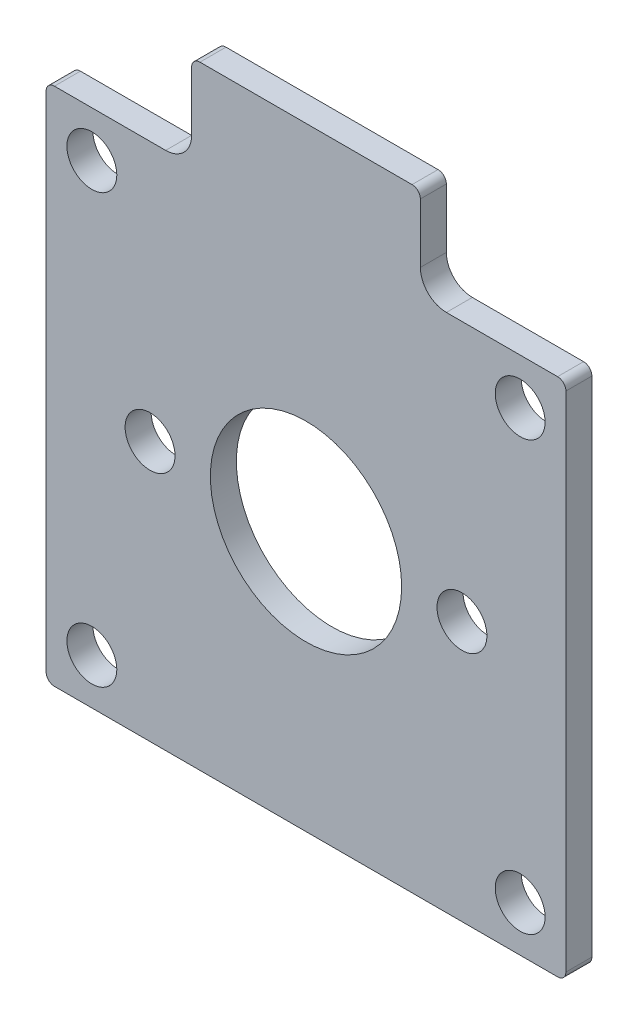
ISO-10303-21;
HEADER;
FILE_DESCRIPTION(('STEP AP214'),'2;1');
FILE_NAME('part.step','',(''),(''),'','','');
FILE_SCHEMA(('AUTOMOTIVE_DESIGN { 1 0 10303 214 1 1 1 1 }'));
ENDSEC;
DATA;
#1=APPLICATION_CONTEXT('core data for automotive mechanical design processes');
#2=APPLICATION_PROTOCOL_DEFINITION('international standard','automotive_design',2000,#1);
#3=PRODUCT_CONTEXT('',#1,'mechanical');
#4=PRODUCT('Part','Part','',(#3));
#5=PRODUCT_RELATED_PRODUCT_CATEGORY('part','',(#4));
#6=PRODUCT_DEFINITION_FORMATION('','',#4);
#7=PRODUCT_DEFINITION_CONTEXT('part definition',#1,'design');
#8=PRODUCT_DEFINITION('design','',#6,#7);
#9=PRODUCT_DEFINITION_SHAPE('','',#8);
#10=(LENGTH_UNIT() NAMED_UNIT(*) SI_UNIT(.MILLI.,.METRE.));
#11=(NAMED_UNIT(*) PLANE_ANGLE_UNIT() SI_UNIT($,.RADIAN.));
#12=(NAMED_UNIT(*) SI_UNIT($,.STERADIAN.) SOLID_ANGLE_UNIT());
#13=UNCERTAINTY_MEASURE_WITH_UNIT(LENGTH_MEASURE(1.E-05),#10,'distance_accuracy_value','');
#14=(GEOMETRIC_REPRESENTATION_CONTEXT(3) GLOBAL_UNCERTAINTY_ASSIGNED_CONTEXT((#13)) GLOBAL_UNIT_ASSIGNED_CONTEXT((#10,
#11,#12)) REPRESENTATION_CONTEXT('',''));
#15=CARTESIAN_POINT('',(0.,0.,0.));
#16=DIRECTION('',(0.,0.,1.));
#17=DIRECTION('',(1.,0.,0.));
#18=AXIS2_PLACEMENT_3D('',#15,#16,#17);
#19=CARTESIAN_POINT('',(15.367,15.875,1.5875));
#20=DIRECTION('',(0.,-1.,0.));
#21=DIRECTION('',(0.,0.,-1.));
#22=AXIS2_PLACEMENT_3D('',#19,#20,#21);
#23=PLANE('',#22);
#24=DIRECTION('',(-1.,0.,0.));
#25=VECTOR('',#24,1.);
#26=CARTESIAN_POINT('',(15.367,15.875,1.5875));
#27=LINE('',#26,#25);
#28=CARTESIAN_POINT('',(-8.5725,15.875,1.5875));
#29=VERTEX_POINT('',#28);
#30=CARTESIAN_POINT('',(-15.367,15.875,1.5875));
#31=VERTEX_POINT('',#30);
#32=EDGE_CURVE('E168',#29,#31,#27,.T.);
#33=ORIENTED_EDGE('',*,*,#32,.F.);
#34=DIRECTION('',(0.,0.,-1.));
#35=VECTOR('',#34,1.);
#36=CARTESIAN_POINT('',(-8.5725,15.875,1.5875));
#37=LINE('',#36,#35);
#38=CARTESIAN_POINT('',(-8.5725,15.875,0.));
#39=VERTEX_POINT('',#38);
#40=EDGE_CURVE('E187',#29,#39,#37,.T.);
#41=ORIENTED_EDGE('',*,*,#40,.T.);
#42=DIRECTION('',(-1.,0.,0.));
#43=VECTOR('',#42,1.);
#44=CARTESIAN_POINT('',(15.367,15.875,0.));
#45=LINE('',#44,#43);
#46=CARTESIAN_POINT('',(-15.367,15.875,0.));
#47=VERTEX_POINT('',#46);
#48=EDGE_CURVE('E313',#39,#47,#45,.T.);
#49=ORIENTED_EDGE('',*,*,#48,.T.);
#50=DIRECTION('',(0.,0.,-1.));
#51=VECTOR('',#50,1.);
#52=CARTESIAN_POINT('',(-15.367,15.875,1.5875));
#53=LINE('',#52,#51);
#54=EDGE_CURVE('E299',#31,#47,#53,.T.);
#55=ORIENTED_EDGE('',*,*,#54,.F.);
#56=EDGE_LOOP('',(#33,#41,#49,#55));
#57=FACE_BOUND('',#56,.T.);
#58=ADVANCED_FACE('F37',(#57),#23,.F.);
#59=CARTESIAN_POINT('',(-15.367,15.367,1.5875));
#60=DIRECTION('',(0.,0.,-1.));
#61=DIRECTION('',(-1.,0.,0.));
#62=AXIS2_PLACEMENT_3D('',#59,#60,#61);
#63=CYLINDRICAL_SURFACE('',#62,0.508);
#64=CARTESIAN_POINT('',(-15.367,15.367,0.));
#65=DIRECTION('',(0.,0.,1.));
#66=DIRECTION('',(1.,0.,0.));
#67=AXIS2_PLACEMENT_3D('',#64,#65,#66);
#68=CIRCLE('',#67,0.508);
#69=CARTESIAN_POINT('',(-15.875,15.367,0.));
#70=VERTEX_POINT('',#69);
#71=EDGE_CURVE('E176',#47,#70,#68,.T.);
#72=ORIENTED_EDGE('',*,*,#71,.T.);
#73=DIRECTION('',(0.,0.,-1.));
#74=VECTOR('',#73,1.);
#75=CARTESIAN_POINT('',(-15.875,15.367,1.5875));
#76=LINE('',#75,#74);
#77=CARTESIAN_POINT('',(-15.875,15.367,1.5875));
#78=VERTEX_POINT('',#77);
#79=EDGE_CURVE('E154',#78,#70,#76,.T.);
#80=ORIENTED_EDGE('',*,*,#79,.F.);
#81=CARTESIAN_POINT('',(-15.367,15.367,1.5875));
#82=DIRECTION('',(0.,0.,1.));
#83=DIRECTION('',(1.,0.,0.));
#84=AXIS2_PLACEMENT_3D('',#81,#82,#83);
#85=CIRCLE('',#84,0.508);
#86=EDGE_CURVE('E161',#31,#78,#85,.T.);
#87=ORIENTED_EDGE('',*,*,#86,.F.);
#88=ORIENTED_EDGE('',*,*,#54,.T.);
#89=EDGE_LOOP('',(#72,#80,#87,#88));
#90=FACE_BOUND('',#89,.T.);
#91=ADVANCED_FACE('F174',(#90),#63,.T.);
#92=CARTESIAN_POINT('',(-15.875,15.367,1.5875));
#93=DIRECTION('',(1.,0.,0.));
#94=DIRECTION('',(0.,1.,0.));
#95=AXIS2_PLACEMENT_3D('',#92,#93,#94);
#96=PLANE('',#95);
#97=DIRECTION('',(0.,-1.,0.));
#98=VECTOR('',#97,1.);
#99=CARTESIAN_POINT('',(-15.875,15.367,0.));
#100=LINE('',#99,#98);
#101=CARTESIAN_POINT('',(-15.875,-15.367,0.));
#102=VERTEX_POINT('',#101);
#103=EDGE_CURVE('E301',#70,#102,#100,.T.);
#104=ORIENTED_EDGE('',*,*,#103,.T.);
#105=DIRECTION('',(0.,0.,-1.));
#106=VECTOR('',#105,1.);
#107=CARTESIAN_POINT('',(-15.875,-15.367,1.5875));
#108=LINE('',#107,#106);
#109=CARTESIAN_POINT('',(-15.875,-15.367,1.5875));
#110=VERTEX_POINT('',#109);
#111=EDGE_CURVE('E157',#110,#102,#108,.T.);
#112=ORIENTED_EDGE('',*,*,#111,.F.);
#113=DIRECTION('',(0.,-1.,0.));
#114=VECTOR('',#113,1.);
#115=CARTESIAN_POINT('',(-15.875,15.367,1.5875));
#116=LINE('',#115,#114);
#117=EDGE_CURVE('E150',#78,#110,#116,.T.);
#118=ORIENTED_EDGE('',*,*,#117,.F.);
#119=ORIENTED_EDGE('',*,*,#79,.T.);
#120=EDGE_LOOP('',(#104,#112,#118,#119));
#121=FACE_BOUND('',#120,.T.);
#122=ADVANCED_FACE('F152',(#121),#96,.F.);
#123=CARTESIAN_POINT('',(-15.367,-15.367,1.5875));
#124=DIRECTION('',(0.,0.,-1.));
#125=DIRECTION('',(-1.,0.,0.));
#126=AXIS2_PLACEMENT_3D('',#123,#124,#125);
#127=CYLINDRICAL_SURFACE('',#126,0.508);
#128=CARTESIAN_POINT('',(-15.367,-15.367,0.));
#129=DIRECTION('',(0.,0.,1.));
#130=DIRECTION('',(-1.,0.,0.));
#131=AXIS2_PLACEMENT_3D('',#128,#129,#130);
#132=CIRCLE('',#131,0.508);
#133=CARTESIAN_POINT('',(-15.367,-15.875,0.));
#134=VERTEX_POINT('',#133);
#135=EDGE_CURVE('E303',#102,#134,#132,.T.);
#136=ORIENTED_EDGE('',*,*,#135,.T.);
#137=DIRECTION('',(0.,0.,-1.));
#138=VECTOR('',#137,1.);
#139=CARTESIAN_POINT('',(-15.367,-15.875,1.5875));
#140=LINE('',#139,#138);
#141=CARTESIAN_POINT('',(-15.367,-15.875,1.5875));
#142=VERTEX_POINT('',#141);
#143=EDGE_CURVE('E182',#142,#134,#140,.T.);
#144=ORIENTED_EDGE('',*,*,#143,.F.);
#145=CARTESIAN_POINT('',(-15.367,-15.367,1.5875));
#146=DIRECTION('',(0.,0.,1.));
#147=DIRECTION('',(-1.,0.,0.));
#148=AXIS2_PLACEMENT_3D('',#145,#146,#147);
#149=CIRCLE('',#148,0.508);
#150=EDGE_CURVE('E160',#110,#142,#149,.T.);
#151=ORIENTED_EDGE('',*,*,#150,.F.);
#152=ORIENTED_EDGE('',*,*,#111,.T.);
#153=EDGE_LOOP('',(#136,#144,#151,#152));
#154=FACE_BOUND('',#153,.T.);
#155=ADVANCED_FACE('F350',(#154),#127,.T.);
#156=CARTESIAN_POINT('',(15.367,-15.875,1.5875));
#157=DIRECTION('',(0.,1.,0.));
#158=DIRECTION('',(-1.,0.,0.));
#159=AXIS2_PLACEMENT_3D('',#156,#157,#158);
#160=PLANE('',#159);
#161=DIRECTION('',(1.,0.,0.));
#162=VECTOR('',#161,1.);
#163=CARTESIAN_POINT('',(15.367,-15.875,0.));
#164=LINE('',#163,#162);
#165=CARTESIAN_POINT('',(15.367,-15.875,0.));
#166=VERTEX_POINT('',#165);
#167=EDGE_CURVE('E305',#134,#166,#164,.T.);
#168=ORIENTED_EDGE('',*,*,#167,.T.);
#169=DIRECTION('',(0.,0.,-1.));
#170=VECTOR('',#169,1.);
#171=CARTESIAN_POINT('',(15.367,-15.875,1.5875));
#172=LINE('',#171,#170);
#173=CARTESIAN_POINT('',(15.367,-15.875,1.5875));
#174=VERTEX_POINT('',#173);
#175=EDGE_CURVE('E326',#174,#166,#172,.T.);
#176=ORIENTED_EDGE('',*,*,#175,.F.);
#177=DIRECTION('',(1.,0.,0.));
#178=VECTOR('',#177,1.);
#179=CARTESIAN_POINT('',(15.367,-15.875,1.5875));
#180=LINE('',#179,#178);
#181=EDGE_CURVE('E288',#142,#174,#180,.T.);
#182=ORIENTED_EDGE('',*,*,#181,.F.);
#183=ORIENTED_EDGE('',*,*,#143,.T.);
#184=EDGE_LOOP('',(#168,#176,#182,#183));
#185=FACE_BOUND('',#184,.T.);
#186=ADVANCED_FACE('F333',(#185),#160,.F.);
#187=CARTESIAN_POINT('',(15.367,-15.367,1.5875));
#188=DIRECTION('',(0.,0.,-1.));
#189=DIRECTION('',(-1.,0.,0.));
#190=AXIS2_PLACEMENT_3D('',#187,#188,#189);
#191=CYLINDRICAL_SURFACE('',#190,0.508);
#192=CARTESIAN_POINT('',(15.367,-15.367,0.));
#193=DIRECTION('',(0.,0.,1.));
#194=DIRECTION('',(-1.,0.,0.));
#195=AXIS2_PLACEMENT_3D('',#192,#193,#194);
#196=CIRCLE('',#195,0.508);
#197=CARTESIAN_POINT('',(15.875,-15.367,0.));
#198=VERTEX_POINT('',#197);
#199=EDGE_CURVE('E307',#166,#198,#196,.T.);
#200=ORIENTED_EDGE('',*,*,#199,.T.);
#201=DIRECTION('',(0.,0.,-1.));
#202=VECTOR('',#201,1.);
#203=CARTESIAN_POINT('',(15.875,-15.367,1.5875));
#204=LINE('',#203,#202);
#205=CARTESIAN_POINT('',(15.875,-15.367,1.5875));
#206=VERTEX_POINT('',#205);
#207=EDGE_CURVE('E323',#206,#198,#204,.T.);
#208=ORIENTED_EDGE('',*,*,#207,.F.);
#209=CARTESIAN_POINT('',(15.367,-15.367,1.5875));
#210=DIRECTION('',(0.,0.,1.));
#211=DIRECTION('',(-1.,0.,0.));
#212=AXIS2_PLACEMENT_3D('',#209,#210,#211);
#213=CIRCLE('',#212,0.508);
#214=EDGE_CURVE('E290',#174,#206,#213,.T.);
#215=ORIENTED_EDGE('',*,*,#214,.F.);
#216=ORIENTED_EDGE('',*,*,#175,.T.);
#217=EDGE_LOOP('',(#200,#208,#215,#216));
#218=FACE_BOUND('',#217,.T.);
#219=ADVANCED_FACE('F342',(#218),#191,.T.);
#220=CARTESIAN_POINT('',(15.875,15.367,1.5875));
#221=DIRECTION('',(-1.,0.,0.));
#222=DIRECTION('',(0.,-1.,0.));
#223=AXIS2_PLACEMENT_3D('',#220,#221,#222);
#224=PLANE('',#223);
#225=DIRECTION('',(0.,1.,0.));
#226=VECTOR('',#225,1.);
#227=CARTESIAN_POINT('',(15.875,15.367,0.));
#228=LINE('',#227,#226);
#229=CARTESIAN_POINT('',(15.875,15.367,0.));
#230=VERTEX_POINT('',#229);
#231=EDGE_CURVE('E309',#198,#230,#228,.T.);
#232=ORIENTED_EDGE('',*,*,#231,.T.);
#233=DIRECTION('',(0.,0.,-1.));
#234=VECTOR('',#233,1.);
#235=CARTESIAN_POINT('',(15.875,15.367,1.5875));
#236=LINE('',#235,#234);
#237=CARTESIAN_POINT('',(15.875,15.367,1.5875));
#238=VERTEX_POINT('',#237);
#239=EDGE_CURVE('E320',#238,#230,#236,.T.);
#240=ORIENTED_EDGE('',*,*,#239,.F.);
#241=DIRECTION('',(0.,1.,0.));
#242=VECTOR('',#241,1.);
#243=CARTESIAN_POINT('',(15.875,15.367,1.5875));
#244=LINE('',#243,#242);
#245=EDGE_CURVE('E292',#206,#238,#244,.T.);
#246=ORIENTED_EDGE('',*,*,#245,.F.);
#247=ORIENTED_EDGE('',*,*,#207,.T.);
#248=EDGE_LOOP('',(#232,#240,#246,#247));
#249=FACE_BOUND('',#248,.T.);
#250=ADVANCED_FACE('F346',(#249),#224,.F.);
#251=CARTESIAN_POINT('',(15.367,15.367,1.5875));
#252=DIRECTION('',(0.,0.,-1.));
#253=DIRECTION('',(-1.,0.,0.));
#254=AXIS2_PLACEMENT_3D('',#251,#252,#253);
#255=CYLINDRICAL_SURFACE('',#254,0.508);
#256=CARTESIAN_POINT('',(15.367,15.367,0.));
#257=DIRECTION('',(0.,0.,1.));
#258=DIRECTION('',(-1.,0.,0.));
#259=AXIS2_PLACEMENT_3D('',#256,#257,#258);
#260=CIRCLE('',#259,0.508);
#261=CARTESIAN_POINT('',(15.367,15.875,0.));
#262=VERTEX_POINT('',#261);
#263=EDGE_CURVE('E311',#230,#262,#260,.T.);
#264=ORIENTED_EDGE('',*,*,#263,.T.);
#265=DIRECTION('',(0.,0.,-1.));
#266=VECTOR('',#265,1.);
#267=CARTESIAN_POINT('',(15.367,15.875,1.5875));
#268=LINE('',#267,#266);
#269=CARTESIAN_POINT('',(15.367,15.875,1.5875));
#270=VERTEX_POINT('',#269);
#271=EDGE_CURVE('E317',#270,#262,#268,.T.);
#272=ORIENTED_EDGE('',*,*,#271,.F.);
#273=CARTESIAN_POINT('',(15.367,15.367,1.5875));
#274=DIRECTION('',(0.,0.,1.));
#275=DIRECTION('',(-1.,0.,0.));
#276=AXIS2_PLACEMENT_3D('',#273,#274,#275);
#277=CIRCLE('',#276,0.508);
#278=EDGE_CURVE('E294',#238,#270,#277,.T.);
#279=ORIENTED_EDGE('',*,*,#278,.F.);
#280=ORIENTED_EDGE('',*,*,#239,.T.);
#281=EDGE_LOOP('',(#264,#272,#279,#280));
#282=FACE_BOUND('',#281,.T.);
#283=ADVANCED_FACE('F370',(#282),#255,.T.);
#284=CARTESIAN_POINT('',(8.5725,15.875,0.));
#285=VERTEX_POINT('',#284);
#286=EDGE_CURVE('E172',#262,#285,#45,.T.);
#287=ORIENTED_EDGE('',*,*,#286,.T.);
#288=DIRECTION('',(0.,0.,1.));
#289=VECTOR('',#288,1.);
#290=CARTESIAN_POINT('',(8.5725,15.875,1.5875));
#291=LINE('',#290,#289);
#292=CARTESIAN_POINT('',(8.5725,15.875,1.5875));
#293=VERTEX_POINT('',#292);
#294=EDGE_CURVE('E177',#285,#293,#291,.T.);
#295=ORIENTED_EDGE('',*,*,#294,.T.);
#296=EDGE_CURVE('E296',#270,#293,#27,.T.);
#297=ORIENTED_EDGE('',*,*,#296,.F.);
#298=ORIENTED_EDGE('',*,*,#271,.T.);
#299=EDGE_LOOP('',(#287,#295,#297,#298));
#300=FACE_BOUND('',#299,.T.);
#301=ADVANCED_FACE('F362',(#300),#23,.F.);
#302=CARTESIAN_POINT('',(-15.367,15.367,1.5875));
#303=DIRECTION('',(0.,0.,1.));
#304=DIRECTION('',(1.,0.,0.));
#305=AXIS2_PLACEMENT_3D('',#302,#303,#304);
#306=PLANE('',#305);
#307=DIRECTION('',(0.,1.,0.));
#308=VECTOR('',#307,1.);
#309=CARTESIAN_POINT('',(6.985,21.59,1.5875));
#310=LINE('',#309,#308);
#311=CARTESIAN_POINT('',(6.985,17.4625,1.5875));
#312=VERTEX_POINT('',#311);
#313=CARTESIAN_POINT('',(6.985,21.082,1.5875));
#314=VERTEX_POINT('',#313);
#315=EDGE_CURVE('E235',#312,#314,#310,.T.);
#316=ORIENTED_EDGE('',*,*,#315,.T.);
#317=CARTESIAN_POINT('',(6.477,21.082,1.5875));
#318=DIRECTION('',(0.,0.,1.));
#319=DIRECTION('',(1.,0.,0.));
#320=AXIS2_PLACEMENT_3D('',#317,#318,#319);
#321=CIRCLE('',#320,0.508);
#322=CARTESIAN_POINT('',(6.477,21.59,1.5875));
#323=VERTEX_POINT('',#322);
#324=EDGE_CURVE('E207',#314,#323,#321,.T.);
#325=ORIENTED_EDGE('',*,*,#324,.T.);
#326=DIRECTION('',(-1.,0.,0.));
#327=VECTOR('',#326,1.);
#328=CARTESIAN_POINT('',(6.985,21.59,1.5875));
#329=LINE('',#328,#327);
#330=CARTESIAN_POINT('',(-6.477,21.59,1.5875));
#331=VERTEX_POINT('',#330);
#332=EDGE_CURVE('E234',#323,#331,#329,.T.);
#333=ORIENTED_EDGE('',*,*,#332,.T.);
#334=CARTESIAN_POINT('',(-6.477,21.082,1.5875));
#335=DIRECTION('',(0.,0.,1.));
#336=DIRECTION('',(1.,0.,0.));
#337=AXIS2_PLACEMENT_3D('',#334,#335,#336);
#338=CIRCLE('',#337,0.508);
#339=CARTESIAN_POINT('',(-6.985,21.082,1.5875));
#340=VERTEX_POINT('',#339);
#341=EDGE_CURVE('E205',#331,#340,#338,.T.);
#342=ORIENTED_EDGE('',*,*,#341,.T.);
#343=DIRECTION('',(0.,-1.,0.));
#344=VECTOR('',#343,1.);
#345=CARTESIAN_POINT('',(-6.985,21.59,1.5875));
#346=LINE('',#345,#344);
#347=CARTESIAN_POINT('',(-6.985,17.4625,1.5875));
#348=VERTEX_POINT('',#347);
#349=EDGE_CURVE('E241',#340,#348,#346,.T.);
#350=ORIENTED_EDGE('',*,*,#349,.T.);
#351=CARTESIAN_POINT('',(-8.5725,17.4625,1.5875));
#352=DIRECTION('',(0.,0.,1.));
#353=DIRECTION('',(1.,0.,0.));
#354=AXIS2_PLACEMENT_3D('',#351,#352,#353);
#355=CIRCLE('',#354,1.5875);
#356=EDGE_CURVE('E200',#348,#29,#355,.F.);
#357=ORIENTED_EDGE('',*,*,#356,.T.);
#358=ORIENTED_EDGE('',*,*,#32,.T.);
#359=ORIENTED_EDGE('',*,*,#86,.T.);
#360=ORIENTED_EDGE('',*,*,#117,.T.);
#361=ORIENTED_EDGE('',*,*,#150,.T.);
#362=ORIENTED_EDGE('',*,*,#181,.T.);
#363=ORIENTED_EDGE('',*,*,#214,.T.);
#364=ORIENTED_EDGE('',*,*,#245,.T.);
#365=ORIENTED_EDGE('',*,*,#278,.T.);
#366=ORIENTED_EDGE('',*,*,#296,.T.);
#367=CARTESIAN_POINT('',(8.5725,17.4625,1.5875));
#368=DIRECTION('',(0.,0.,1.));
#369=DIRECTION('',(1.,0.,0.));
#370=AXIS2_PLACEMENT_3D('',#367,#368,#369);
#371=CIRCLE('',#370,1.5875);
#372=EDGE_CURVE('E193',#293,#312,#371,.F.);
#373=ORIENTED_EDGE('',*,*,#372,.T.);
#374=EDGE_LOOP('',(#316,#325,#333,#342,#350,#357,#358,#359,#360,#361,#362,#363,#364,#365,#366,#373));
#375=FACE_BOUND('',#374,.T.);
#376=CARTESIAN_POINT('',(-13.081,13.081,1.5875));
#377=DIRECTION('',(0.,0.,1.));
#378=DIRECTION('',(1.,0.,0.));
#379=AXIS2_PLACEMENT_3D('',#376,#377,#378);
#380=CIRCLE('',#379,1.524);
#381=CARTESIAN_POINT('',(-11.557,13.081,1.5875));
#382=VERTEX_POINT('',#381);
#383=EDGE_CURVE('E245',#382,#382,#380,.T.);
#384=ORIENTED_EDGE('',*,*,#383,.F.);
#385=EDGE_LOOP('',(#384));
#386=FACE_BOUND('',#385,.T.);
#387=CARTESIAN_POINT('',(13.081,13.081,1.5875));
#388=DIRECTION('',(0.,0.,1.));
#389=DIRECTION('',(1.,0.,0.));
#390=AXIS2_PLACEMENT_3D('',#387,#388,#389);
#391=CIRCLE('',#390,1.524);
#392=CARTESIAN_POINT('',(14.605,13.081,1.5875));
#393=VERTEX_POINT('',#392);
#394=EDGE_CURVE('E251',#393,#393,#391,.T.);
#395=ORIENTED_EDGE('',*,*,#394,.F.);
#396=EDGE_LOOP('',(#395));
#397=FACE_BOUND('',#396,.T.);
#398=CARTESIAN_POINT('',(13.081,-13.081,1.5875));
#399=DIRECTION('',(0.,0.,1.));
#400=DIRECTION('',(1.,0.,0.));
#401=AXIS2_PLACEMENT_3D('',#398,#399,#400);
#402=CIRCLE('',#401,1.524);
#403=CARTESIAN_POINT('',(14.605,-13.081,1.5875));
#404=VERTEX_POINT('',#403);
#405=EDGE_CURVE('E257',#404,#404,#402,.T.);
#406=ORIENTED_EDGE('',*,*,#405,.F.);
#407=EDGE_LOOP('',(#406));
#408=FACE_BOUND('',#407,.T.);
#409=CARTESIAN_POINT('',(-13.081,-13.081,1.5875));
#410=DIRECTION('',(0.,0.,1.));
#411=DIRECTION('',(1.,0.,0.));
#412=AXIS2_PLACEMENT_3D('',#409,#410,#411);
#413=CIRCLE('',#412,1.524);
#414=CARTESIAN_POINT('',(-11.557,-13.081,1.5875));
#415=VERTEX_POINT('',#414);
#416=EDGE_CURVE('E263',#415,#415,#413,.T.);
#417=ORIENTED_EDGE('',*,*,#416,.F.);
#418=EDGE_LOOP('',(#417));
#419=FACE_BOUND('',#418,.T.);
#420=CARTESIAN_POINT('',(-9.525,0.,1.5875));
#421=DIRECTION('',(0.,0.,1.));
#422=DIRECTION('',(1.,0.,0.));
#423=AXIS2_PLACEMENT_3D('',#420,#421,#422);
#424=CIRCLE('',#423,1.524);
#425=CARTESIAN_POINT('',(-8.001,0.,1.5875));
#426=VERTEX_POINT('',#425);
#427=EDGE_CURVE('E269',#426,#426,#424,.T.);
#428=ORIENTED_EDGE('',*,*,#427,.F.);
#429=EDGE_LOOP('',(#428));
#430=FACE_BOUND('',#429,.T.);
#431=CARTESIAN_POINT('',(9.525,0.,1.5875));
#432=DIRECTION('',(0.,0.,1.));
#433=DIRECTION('',(1.,0.,0.));
#434=AXIS2_PLACEMENT_3D('',#431,#432,#433);
#435=CIRCLE('',#434,1.524);
#436=CARTESIAN_POINT('',(11.049,0.,1.5875));
#437=VERTEX_POINT('',#436);
#438=EDGE_CURVE('E275',#437,#437,#435,.T.);
#439=ORIENTED_EDGE('',*,*,#438,.F.);
#440=EDGE_LOOP('',(#439));
#441=FACE_BOUND('',#440,.T.);
#442=CARTESIAN_POINT('',(0.,0.,1.5875));
#443=DIRECTION('',(0.,0.,1.));
#444=DIRECTION('',(1.,0.,0.));
#445=AXIS2_PLACEMENT_3D('',#442,#443,#444);
#446=CIRCLE('',#445,5.842);
#447=CARTESIAN_POINT('',(5.842,0.,1.5875));
#448=VERTEX_POINT('',#447);
#449=EDGE_CURVE('E281',#448,#448,#446,.T.);
#450=ORIENTED_EDGE('',*,*,#449,.F.);
#451=EDGE_LOOP('',(#450));
#452=FACE_BOUND('',#451,.T.);
#453=ADVANCED_FACE('F165',(#375,#386,#397,#408,#419,#430,#441,#452),#306,.T.);
#454=CARTESIAN_POINT('',(-15.367,15.367,0.));
#455=DIRECTION('',(0.,0.,1.));
#456=DIRECTION('',(1.,0.,0.));
#457=AXIS2_PLACEMENT_3D('',#454,#455,#456);
#458=PLANE('',#457);
#459=DIRECTION('',(-1.,0.,0.));
#460=VECTOR('',#459,1.);
#461=CARTESIAN_POINT('',(6.985,21.59,0.));
#462=LINE('',#461,#460);
#463=CARTESIAN_POINT('',(6.477,21.59,0.));
#464=VERTEX_POINT('',#463);
#465=CARTESIAN_POINT('',(-6.477,21.59,0.));
#466=VERTEX_POINT('',#465);
#467=EDGE_CURVE('E221',#464,#466,#462,.T.);
#468=ORIENTED_EDGE('',*,*,#467,.F.);
#469=CARTESIAN_POINT('',(6.477,21.082,0.));
#470=DIRECTION('',(0.,0.,1.));
#471=DIRECTION('',(1.,0.,0.));
#472=AXIS2_PLACEMENT_3D('',#469,#470,#471);
#473=CIRCLE('',#472,0.508);
#474=CARTESIAN_POINT('',(6.985,21.082,0.));
#475=VERTEX_POINT('',#474);
#476=EDGE_CURVE('E45',#464,#475,#473,.F.);
#477=ORIENTED_EDGE('',*,*,#476,.T.);
#478=DIRECTION('',(0.,1.,0.));
#479=VECTOR('',#478,1.);
#480=CARTESIAN_POINT('',(6.985,21.59,0.));
#481=LINE('',#480,#479);
#482=CARTESIAN_POINT('',(6.985,17.4625,0.));
#483=VERTEX_POINT('',#482);
#484=EDGE_CURVE('E219',#483,#475,#481,.T.);
#485=ORIENTED_EDGE('',*,*,#484,.F.);
#486=CARTESIAN_POINT('',(8.5725,17.4625,0.));
#487=DIRECTION('',(0.,0.,1.));
#488=DIRECTION('',(1.,0.,0.));
#489=AXIS2_PLACEMENT_3D('',#486,#487,#488);
#490=CIRCLE('',#489,1.5875);
#491=EDGE_CURVE('E195',#483,#285,#490,.T.);
#492=ORIENTED_EDGE('',*,*,#491,.T.);
#493=ORIENTED_EDGE('',*,*,#286,.F.);
#494=ORIENTED_EDGE('',*,*,#263,.F.);
#495=ORIENTED_EDGE('',*,*,#231,.F.);
#496=ORIENTED_EDGE('',*,*,#199,.F.);
#497=ORIENTED_EDGE('',*,*,#167,.F.);
#498=ORIENTED_EDGE('',*,*,#135,.F.);
#499=ORIENTED_EDGE('',*,*,#103,.F.);
#500=ORIENTED_EDGE('',*,*,#71,.F.);
#501=ORIENTED_EDGE('',*,*,#48,.F.);
#502=CARTESIAN_POINT('',(-8.5725,17.4625,0.));
#503=DIRECTION('',(0.,0.,1.));
#504=DIRECTION('',(1.,0.,0.));
#505=AXIS2_PLACEMENT_3D('',#502,#503,#504);
#506=CIRCLE('',#505,1.5875);
#507=CARTESIAN_POINT('',(-6.985,17.4625,0.));
#508=VERTEX_POINT('',#507);
#509=EDGE_CURVE('E197',#39,#508,#506,.T.);
#510=ORIENTED_EDGE('',*,*,#509,.T.);
#511=DIRECTION('',(0.,-1.,0.));
#512=VECTOR('',#511,1.);
#513=CARTESIAN_POINT('',(-6.985,21.59,0.));
#514=LINE('',#513,#512);
#515=CARTESIAN_POINT('',(-6.985,21.082,0.));
#516=VERTEX_POINT('',#515);
#517=EDGE_CURVE('E229',#516,#508,#514,.T.);
#518=ORIENTED_EDGE('',*,*,#517,.F.);
#519=CARTESIAN_POINT('',(-6.477,21.082,0.));
#520=DIRECTION('',(0.,0.,1.));
#521=DIRECTION('',(1.,0.,0.));
#522=AXIS2_PLACEMENT_3D('',#519,#520,#521);
#523=CIRCLE('',#522,0.508);
#524=EDGE_CURVE('E57',#516,#466,#523,.F.);
#525=ORIENTED_EDGE('',*,*,#524,.T.);
#526=EDGE_LOOP('',(#468,#477,#485,#492,#493,#494,#495,#496,#497,#498,#499,#500,#501,#510,#518,#525));
#527=FACE_BOUND('',#526,.T.);
#528=CARTESIAN_POINT('',(-13.081,13.081,0.));
#529=DIRECTION('',(0.,0.,1.));
#530=DIRECTION('',(1.,0.,0.));
#531=AXIS2_PLACEMENT_3D('',#528,#529,#530);
#532=CIRCLE('',#531,1.524);
#533=CARTESIAN_POINT('',(-11.557,13.081,0.));
#534=VERTEX_POINT('',#533);
#535=EDGE_CURVE('E248',#534,#534,#532,.T.);
#536=ORIENTED_EDGE('',*,*,#535,.T.);
#537=EDGE_LOOP('',(#536));
#538=FACE_BOUND('',#537,.T.);
#539=CARTESIAN_POINT('',(13.081,13.081,0.));
#540=DIRECTION('',(0.,0.,1.));
#541=DIRECTION('',(1.,0.,0.));
#542=AXIS2_PLACEMENT_3D('',#539,#540,#541);
#543=CIRCLE('',#542,1.524);
#544=CARTESIAN_POINT('',(14.605,13.081,0.));
#545=VERTEX_POINT('',#544);
#546=EDGE_CURVE('E254',#545,#545,#543,.T.);
#547=ORIENTED_EDGE('',*,*,#546,.T.);
#548=EDGE_LOOP('',(#547));
#549=FACE_BOUND('',#548,.T.);
#550=CARTESIAN_POINT('',(13.081,-13.081,0.));
#551=DIRECTION('',(0.,0.,1.));
#552=DIRECTION('',(1.,0.,0.));
#553=AXIS2_PLACEMENT_3D('',#550,#551,#552);
#554=CIRCLE('',#553,1.524);
#555=CARTESIAN_POINT('',(14.605,-13.081,0.));
#556=VERTEX_POINT('',#555);
#557=EDGE_CURVE('E260',#556,#556,#554,.T.);
#558=ORIENTED_EDGE('',*,*,#557,.T.);
#559=EDGE_LOOP('',(#558));
#560=FACE_BOUND('',#559,.T.);
#561=CARTESIAN_POINT('',(-13.081,-13.081,0.));
#562=DIRECTION('',(0.,0.,1.));
#563=DIRECTION('',(1.,0.,0.));
#564=AXIS2_PLACEMENT_3D('',#561,#562,#563);
#565=CIRCLE('',#564,1.524);
#566=CARTESIAN_POINT('',(-11.557,-13.081,0.));
#567=VERTEX_POINT('',#566);
#568=EDGE_CURVE('E266',#567,#567,#565,.T.);
#569=ORIENTED_EDGE('',*,*,#568,.T.);
#570=EDGE_LOOP('',(#569));
#571=FACE_BOUND('',#570,.T.);
#572=CARTESIAN_POINT('',(-9.525,0.,0.));
#573=DIRECTION('',(0.,0.,1.));
#574=DIRECTION('',(1.,0.,0.));
#575=AXIS2_PLACEMENT_3D('',#572,#573,#574);
#576=CIRCLE('',#575,1.524);
#577=CARTESIAN_POINT('',(-8.001,0.,0.));
#578=VERTEX_POINT('',#577);
#579=EDGE_CURVE('E272',#578,#578,#576,.T.);
#580=ORIENTED_EDGE('',*,*,#579,.T.);
#581=EDGE_LOOP('',(#580));
#582=FACE_BOUND('',#581,.T.);
#583=CARTESIAN_POINT('',(9.525,0.,0.));
#584=DIRECTION('',(0.,0.,1.));
#585=DIRECTION('',(1.,0.,0.));
#586=AXIS2_PLACEMENT_3D('',#583,#584,#585);
#587=CIRCLE('',#586,1.524);
#588=CARTESIAN_POINT('',(11.049,0.,0.));
#589=VERTEX_POINT('',#588);
#590=EDGE_CURVE('E278',#589,#589,#587,.T.);
#591=ORIENTED_EDGE('',*,*,#590,.T.);
#592=EDGE_LOOP('',(#591));
#593=FACE_BOUND('',#592,.T.);
#594=CARTESIAN_POINT('',(0.,0.,0.));
#595=DIRECTION('',(0.,0.,1.));
#596=DIRECTION('',(1.,0.,0.));
#597=AXIS2_PLACEMENT_3D('',#594,#595,#596);
#598=CIRCLE('',#597,5.842);
#599=CARTESIAN_POINT('',(5.842,0.,0.));
#600=VERTEX_POINT('',#599);
#601=EDGE_CURVE('E282',#600,#600,#598,.T.);
#602=ORIENTED_EDGE('',*,*,#601,.T.);
#603=EDGE_LOOP('',(#602));
#604=FACE_BOUND('',#603,.T.);
#605=ADVANCED_FACE('F217',(#527,#538,#549,#560,#571,#582,#593,#604),#458,.F.);
#606=CARTESIAN_POINT('',(0.,0.,0.));
#607=DIRECTION('',(0.,0.,1.));
#608=DIRECTION('',(1.,0.,0.));
#609=AXIS2_PLACEMENT_3D('',#606,#607,#608);
#610=CYLINDRICAL_SURFACE('',#609,5.842);
#611=ORIENTED_EDGE('',*,*,#601,.F.);
#612=EDGE_LOOP('',(#611));
#613=FACE_BOUND('',#612,.T.);
#614=ORIENTED_EDGE('',*,*,#449,.T.);
#615=EDGE_LOOP('',(#614));
#616=FACE_BOUND('',#615,.T.);
#617=ADVANCED_FACE('F436',(#613,#616),#610,.F.);
#618=CARTESIAN_POINT('',(9.525,0.,1.5875));
#619=DIRECTION('',(0.,0.,1.));
#620=DIRECTION('',(1.,0.,0.));
#621=AXIS2_PLACEMENT_3D('',#618,#619,#620);
#622=CYLINDRICAL_SURFACE('',#621,1.524);
#623=ORIENTED_EDGE('',*,*,#590,.F.);
#624=EDGE_LOOP('',(#623));
#625=FACE_BOUND('',#624,.T.);
#626=ORIENTED_EDGE('',*,*,#438,.T.);
#627=EDGE_LOOP('',(#626));
#628=FACE_BOUND('',#627,.T.);
#629=ADVANCED_FACE('F432',(#625,#628),#622,.F.);
#630=CARTESIAN_POINT('',(-9.525,0.,1.5875));
#631=DIRECTION('',(0.,0.,1.));
#632=DIRECTION('',(1.,0.,0.));
#633=AXIS2_PLACEMENT_3D('',#630,#631,#632);
#634=CYLINDRICAL_SURFACE('',#633,1.524);
#635=ORIENTED_EDGE('',*,*,#579,.F.);
#636=EDGE_LOOP('',(#635));
#637=FACE_BOUND('',#636,.T.);
#638=ORIENTED_EDGE('',*,*,#427,.T.);
#639=EDGE_LOOP('',(#638));
#640=FACE_BOUND('',#639,.T.);
#641=ADVANCED_FACE('F428',(#637,#640),#634,.F.);
#642=CARTESIAN_POINT('',(-13.081,-13.081,1.5875));
#643=DIRECTION('',(0.,0.,1.));
#644=DIRECTION('',(1.,0.,0.));
#645=AXIS2_PLACEMENT_3D('',#642,#643,#644);
#646=CYLINDRICAL_SURFACE('',#645,1.524);
#647=ORIENTED_EDGE('',*,*,#568,.F.);
#648=EDGE_LOOP('',(#647));
#649=FACE_BOUND('',#648,.T.);
#650=ORIENTED_EDGE('',*,*,#416,.T.);
#651=EDGE_LOOP('',(#650));
#652=FACE_BOUND('',#651,.T.);
#653=ADVANCED_FACE('F424',(#649,#652),#646,.F.);
#654=CARTESIAN_POINT('',(13.081,-13.081,1.5875));
#655=DIRECTION('',(0.,0.,1.));
#656=DIRECTION('',(1.,0.,0.));
#657=AXIS2_PLACEMENT_3D('',#654,#655,#656);
#658=CYLINDRICAL_SURFACE('',#657,1.524);
#659=ORIENTED_EDGE('',*,*,#557,.F.);
#660=EDGE_LOOP('',(#659));
#661=FACE_BOUND('',#660,.T.);
#662=ORIENTED_EDGE('',*,*,#405,.T.);
#663=EDGE_LOOP('',(#662));
#664=FACE_BOUND('',#663,.T.);
#665=ADVANCED_FACE('F420',(#661,#664),#658,.F.);
#666=CARTESIAN_POINT('',(13.081,13.081,1.5875));
#667=DIRECTION('',(0.,0.,1.));
#668=DIRECTION('',(1.,0.,0.));
#669=AXIS2_PLACEMENT_3D('',#666,#667,#668);
#670=CYLINDRICAL_SURFACE('',#669,1.524);
#671=ORIENTED_EDGE('',*,*,#546,.F.);
#672=EDGE_LOOP('',(#671));
#673=FACE_BOUND('',#672,.T.);
#674=ORIENTED_EDGE('',*,*,#394,.T.);
#675=EDGE_LOOP('',(#674));
#676=FACE_BOUND('',#675,.T.);
#677=ADVANCED_FACE('F414',(#673,#676),#670,.F.);
#678=CARTESIAN_POINT('',(-13.081,13.081,1.5875));
#679=DIRECTION('',(0.,0.,1.));
#680=DIRECTION('',(1.,0.,0.));
#681=AXIS2_PLACEMENT_3D('',#678,#679,#680);
#682=CYLINDRICAL_SURFACE('',#681,1.524);
#683=ORIENTED_EDGE('',*,*,#535,.F.);
#684=EDGE_LOOP('',(#683));
#685=FACE_BOUND('',#684,.T.);
#686=ORIENTED_EDGE('',*,*,#383,.T.);
#687=EDGE_LOOP('',(#686));
#688=FACE_BOUND('',#687,.T.);
#689=ADVANCED_FACE('F407',(#685,#688),#682,.F.);
#690=CARTESIAN_POINT('',(-6.985,21.59,0.));
#691=DIRECTION('',(-1.,0.,0.));
#692=DIRECTION('',(0.,-1.,0.));
#693=AXIS2_PLACEMENT_3D('',#690,#691,#692);
#694=PLANE('',#693);
#695=ORIENTED_EDGE('',*,*,#349,.F.);
#696=DIRECTION('',(0.,0.,1.));
#697=VECTOR('',#696,1.);
#698=CARTESIAN_POINT('',(-6.985,21.082,0.));
#699=LINE('',#698,#697);
#700=EDGE_CURVE('E11',#340,#516,#699,.F.);
#701=ORIENTED_EDGE('',*,*,#700,.T.);
#702=ORIENTED_EDGE('',*,*,#517,.T.);
#703=DIRECTION('',(0.,0.,-1.));
#704=VECTOR('',#703,1.);
#705=CARTESIAN_POINT('',(-6.985,17.4625,0.));
#706=LINE('',#705,#704);
#707=EDGE_CURVE('E190',#508,#348,#706,.F.);
#708=ORIENTED_EDGE('',*,*,#707,.T.);
#709=EDGE_LOOP('',(#695,#701,#702,#708));
#710=FACE_BOUND('',#709,.T.);
#711=ADVANCED_FACE('F400',(#710),#694,.T.);
#712=CARTESIAN_POINT('',(6.985,21.59,0.));
#713=DIRECTION('',(1.,0.,0.));
#714=DIRECTION('',(0.,1.,0.));
#715=AXIS2_PLACEMENT_3D('',#712,#713,#714);
#716=PLANE('',#715);
#717=ORIENTED_EDGE('',*,*,#484,.T.);
#718=DIRECTION('',(0.,0.,1.));
#719=VECTOR('',#718,1.);
#720=CARTESIAN_POINT('',(6.985,21.082,0.));
#721=LINE('',#720,#719);
#722=EDGE_CURVE('E202',#475,#314,#721,.T.);
#723=ORIENTED_EDGE('',*,*,#722,.T.);
#724=ORIENTED_EDGE('',*,*,#315,.F.);
#725=DIRECTION('',(0.,0.,1.));
#726=VECTOR('',#725,1.);
#727=CARTESIAN_POINT('',(6.985,17.4625,0.));
#728=LINE('',#727,#726);
#729=EDGE_CURVE('E180',#312,#483,#728,.F.);
#730=ORIENTED_EDGE('',*,*,#729,.T.);
#731=EDGE_LOOP('',(#717,#723,#724,#730));
#732=FACE_BOUND('',#731,.T.);
#733=ADVANCED_FACE('F226',(#732),#716,.T.);
#734=CARTESIAN_POINT('',(6.985,21.59,0.));
#735=DIRECTION('',(0.,1.,0.));
#736=DIRECTION('',(-1.,0.,0.));
#737=AXIS2_PLACEMENT_3D('',#734,#735,#736);
#738=PLANE('',#737);
#739=ORIENTED_EDGE('',*,*,#332,.F.);
#740=DIRECTION('',(0.,0.,1.));
#741=VECTOR('',#740,1.);
#742=CARTESIAN_POINT('',(6.477,21.59,0.));
#743=LINE('',#742,#741);
#744=EDGE_CURVE('E212',#323,#464,#743,.F.);
#745=ORIENTED_EDGE('',*,*,#744,.T.);
#746=ORIENTED_EDGE('',*,*,#467,.T.);
#747=DIRECTION('',(0.,0.,1.));
#748=VECTOR('',#747,1.);
#749=CARTESIAN_POINT('',(-6.477,21.59,0.));
#750=LINE('',#749,#748);
#751=EDGE_CURVE('E209',#466,#331,#750,.T.);
#752=ORIENTED_EDGE('',*,*,#751,.T.);
#753=EDGE_LOOP('',(#739,#745,#746,#752));
#754=FACE_BOUND('',#753,.T.);
#755=ADVANCED_FACE('F237',(#754),#738,.T.);
#756=CARTESIAN_POINT('',(8.5725,17.4625,1.5875));
#757=DIRECTION('',(0.,0.,1.));
#758=DIRECTION('',(1.,0.,0.));
#759=AXIS2_PLACEMENT_3D('',#756,#757,#758);
#760=CYLINDRICAL_SURFACE('',#759,1.5875);
#761=ORIENTED_EDGE('',*,*,#491,.F.);
#762=ORIENTED_EDGE('',*,*,#729,.F.);
#763=ORIENTED_EDGE('',*,*,#372,.F.);
#764=ORIENTED_EDGE('',*,*,#294,.F.);
#765=EDGE_LOOP('',(#761,#762,#763,#764));
#766=FACE_BOUND('',#765,.T.);
#767=ADVANCED_FACE('F382',(#766),#760,.F.);
#768=CARTESIAN_POINT('',(-8.5725,17.4625,1.5875));
#769=DIRECTION('',(0.,0.,-1.));
#770=DIRECTION('',(-1.,0.,0.));
#771=AXIS2_PLACEMENT_3D('',#768,#769,#770);
#772=CYLINDRICAL_SURFACE('',#771,1.5875);
#773=ORIENTED_EDGE('',*,*,#356,.F.);
#774=ORIENTED_EDGE('',*,*,#707,.F.);
#775=ORIENTED_EDGE('',*,*,#509,.F.);
#776=ORIENTED_EDGE('',*,*,#40,.F.);
#777=EDGE_LOOP('',(#773,#774,#775,#776));
#778=FACE_BOUND('',#777,.T.);
#779=ADVANCED_FACE('F384',(#778),#772,.F.);
#780=CARTESIAN_POINT('',(6.477,21.082,0.));
#781=DIRECTION('',(0.,0.,1.));
#782=DIRECTION('',(1.,0.,0.));
#783=AXIS2_PLACEMENT_3D('',#780,#781,#782);
#784=CYLINDRICAL_SURFACE('',#783,0.508);
#785=ORIENTED_EDGE('',*,*,#476,.F.);
#786=ORIENTED_EDGE('',*,*,#744,.F.);
#787=ORIENTED_EDGE('',*,*,#324,.F.);
#788=ORIENTED_EDGE('',*,*,#722,.F.);
#789=EDGE_LOOP('',(#785,#786,#787,#788));
#790=FACE_BOUND('',#789,.T.);
#791=ADVANCED_FACE('F231',(#790),#784,.T.);
#792=CARTESIAN_POINT('',(-6.477,21.082,0.));
#793=DIRECTION('',(0.,0.,1.));
#794=DIRECTION('',(1.,0.,0.));
#795=AXIS2_PLACEMENT_3D('',#792,#793,#794);
#796=CYLINDRICAL_SURFACE('',#795,0.508);
#797=ORIENTED_EDGE('',*,*,#524,.F.);
#798=ORIENTED_EDGE('',*,*,#700,.F.);
#799=ORIENTED_EDGE('',*,*,#341,.F.);
#800=ORIENTED_EDGE('',*,*,#751,.F.);
#801=EDGE_LOOP('',(#797,#798,#799,#800));
#802=FACE_BOUND('',#801,.T.);
#803=ADVANCED_FACE('F39',(#802),#796,.T.);
#804=CLOSED_SHELL('',(#58,#91,#122,#155,#186,#219,#250,#283,#301,#453,#605,#617,#629,#641,#653,
#665,#677,#689,#711,#733,#755,#767,#779,#791,#803));
#805=MANIFOLD_SOLID_BREP('B2',#804);
#806=ADVANCED_BREP_SHAPE_REPRESENTATION('',(#18,#805),#14);
#807=SHAPE_DEFINITION_REPRESENTATION(#9,#806);
ENDSEC;
END-ISO-10303-21;
